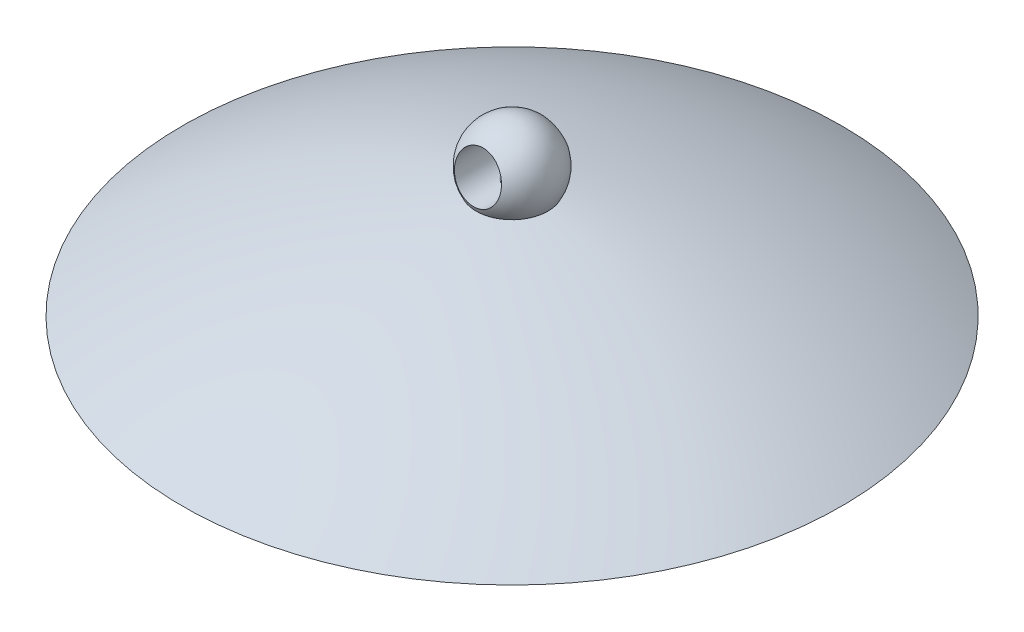
ISO-10303-21;
HEADER;
FILE_DESCRIPTION(('STEP AP214'),'2;1');
FILE_NAME('part.step','',(''),(''),'','','');
FILE_SCHEMA(('AUTOMOTIVE_DESIGN { 1 0 10303 214 1 1 1 1 }'));
ENDSEC;
DATA;
#1=APPLICATION_CONTEXT('core data for automotive mechanical design processes');
#2=APPLICATION_PROTOCOL_DEFINITION('international standard','automotive_design',2000,#1);
#3=PRODUCT_CONTEXT('',#1,'mechanical');
#4=PRODUCT('Part','Part','',(#3));
#5=PRODUCT_RELATED_PRODUCT_CATEGORY('part','',(#4));
#6=PRODUCT_DEFINITION_FORMATION('','',#4);
#7=PRODUCT_DEFINITION_CONTEXT('part definition',#1,'design');
#8=PRODUCT_DEFINITION('design','',#6,#7);
#9=PRODUCT_DEFINITION_SHAPE('','',#8);
#10=(LENGTH_UNIT() NAMED_UNIT(*) SI_UNIT(.MILLI.,.METRE.));
#11=(NAMED_UNIT(*) PLANE_ANGLE_UNIT() SI_UNIT($,.RADIAN.));
#12=(NAMED_UNIT(*) SI_UNIT($,.STERADIAN.) SOLID_ANGLE_UNIT());
#13=UNCERTAINTY_MEASURE_WITH_UNIT(LENGTH_MEASURE(1.E-05),#10,'distance_accuracy_value','');
#14=(GEOMETRIC_REPRESENTATION_CONTEXT(3) GLOBAL_UNCERTAINTY_ASSIGNED_CONTEXT((#13)) GLOBAL_UNIT_ASSIGNED_CONTEXT((#10,
#11,#12)) REPRESENTATION_CONTEXT('',''));
#15=CARTESIAN_POINT('',(0.,0.,0.));
#16=DIRECTION('',(0.,0.,1.));
#17=DIRECTION('',(1.,0.,0.));
#18=AXIS2_PLACEMENT_3D('',#15,#16,#17);
#19=CARTESIAN_POINT('',(0.,21.1056881977187,0.));
#20=DIRECTION('',(0.,-1.,0.));
#21=DIRECTION('',(1.,0.,0.));
#22=AXIS2_PLACEMENT_3D('',#19,#20,#21);
#23=SPHERICAL_SURFACE('',#22,6.78250646828144);
#24=CARTESIAN_POINT('',(-2.74655621210396,19.7015041310095,-6.04045445913077));
#25=CARTESIAN_POINT('',(-2.60538666238214,19.5490548114015,-6.06919928360541));
#26=CARTESIAN_POINT('',(-2.45118052789062,19.408045801728,-6.09558169167268));
#27=CARTESIAN_POINT('',(-2.12082004140231,19.1532265805558,-6.14301004008821));
#28=CARTESIAN_POINT('',(-1.94464399210491,19.039443586056,-6.16405064167016));
#29=CARTESIAN_POINT('',(-1.57525685654205,18.8426602519354,-6.20030429922017));
#30=CARTESIAN_POINT('',(-1.38204359063344,18.7596638580671,-6.21551660821563));
#31=CARTESIAN_POINT('',(-0.984146040427059,18.6271069585446,-6.23975952797583));
#32=CARTESIAN_POINT('',(-0.779464468628433,18.5775385823059,-6.24879159387836));
#33=CARTESIAN_POINT('',(-0.36638859466949,18.5136659172797,-6.26042261228786));
#34=CARTESIAN_POINT('',(-0.158044467273947,18.4990474263572,-6.26307888453168));
#35=CARTESIAN_POINT('',(0.25816378535431,18.5046147041414,-6.26206639311058));
#36=CARTESIAN_POINT('',(0.466027913872259,18.5248002339293,-6.25839767286477));
#37=CARTESIAN_POINT('',(0.874340758139472,18.5991617950192,-6.24485005797768));
#38=CARTESIAN_POINT('',(1.07482010841468,18.6531752794225,-6.2350008607422));
#39=CARTESIAN_POINT('',(1.46377891573875,18.7933777127773,-6.20933716707047));
#40=CARTESIAN_POINT('',(1.65225828120654,18.8795669072519,-6.19352262511449));
#41=CARTESIAN_POINT('',(2.01288883763155,19.0819895548244,-6.15618603813344));
#42=CARTESIAN_POINT('',(2.18495793012608,19.1983642364492,-6.13463715125512));
#43=CARTESIAN_POINT('',(2.50710253178697,19.4574751079959,-6.08634075229555));
#44=CARTESIAN_POINT('',(2.65717687289484,19.6002126970434,-6.05959296429557));
#45=CARTESIAN_POINT('',(2.93317720155947,19.909871574178,-6.00110955108384));
#46=CARTESIAN_POINT('',(3.0587689670924,20.077079419733,-5.96931438169568));
#47=CARTESIAN_POINT('',(3.28015884091955,20.4294360262052,-5.90170155616865));
#48=CARTESIAN_POINT('',(3.37595441983273,20.6145863084966,-5.86588355888535));
#49=CARTESIAN_POINT('',(3.53676591435141,21.0008975986491,-5.79039364970126));
#50=CARTESIAN_POINT('',(3.6012299532845,21.2022775478495,-5.75066650007975));
#51=CARTESIAN_POINT('',(3.69538222563402,21.6125420742393,-5.66882924121501));
#52=CARTESIAN_POINT('',(3.72506733519843,21.8214273238201,-5.62671891827062));
#53=CARTESIAN_POINT('',(3.7492142987302,22.2442218444931,-5.54048187131021));
#54=CARTESIAN_POINT('',(3.74311987232296,22.458158673598,-5.49633394770215));
#55=CARTESIAN_POINT('',(3.69466040264361,22.8818469589024,-5.40782487704735));
#56=CARTESIAN_POINT('',(3.65229300585108,23.0915981426185,-5.36346371635073));
#57=CARTESIAN_POINT('',(3.53196362457388,23.502614231679,-5.27546405424385));
#58=CARTESIAN_POINT('',(3.45373289888084,23.7038023023709,-5.23183363412041));
#59=CARTESIAN_POINT('',(3.2636422641545,24.090190200972,-5.1470316365888));
#60=CARTESIAN_POINT('',(3.1517823996465,24.2753900500492,-5.10586005592518));
#61=CARTESIAN_POINT('',(2.89811898434027,24.6233030135411,-5.02765200118513));
#62=CARTESIAN_POINT('',(2.75649337979403,24.7861406527795,-4.9905928688206));
#63=CARTESIAN_POINT('',(2.44670673964842,25.0856030175895,-4.92177605813534));
#64=CARTESIAN_POINT('',(2.27854841381658,25.2222304168398,-4.89001783911704));
#65=CARTESIAN_POINT('',(1.92397808442709,25.4624492964108,-4.83374153904305));
#66=CARTESIAN_POINT('',(1.73799590865465,25.5666440715629,-4.80909195887586));
#67=CARTESIAN_POINT('',(1.35034419285335,25.7421908584165,-4.7673363734533));
#68=CARTESIAN_POINT('',(1.14867727251651,25.8135483409449,-4.75022911163686));
#69=CARTESIAN_POINT('',(0.740947967132328,25.9195918445246,-4.72473454533155));
#70=CARTESIAN_POINT('',(0.535131202726846,25.9551719791778,-4.7161347250612));
#71=CARTESIAN_POINT('',(0.120277768677626,25.9916276231622,-4.70732271020955));
#72=CARTESIAN_POINT('',(-0.0887585308840101,25.9925070919495,-4.70710955868279));
#73=CARTESIAN_POINT('',(-0.500552584656983,25.9598073269342,-4.71501471171187));
#74=CARTESIAN_POINT('',(-0.703357245499722,25.9267821638162,-4.72299905269232));
#75=CARTESIAN_POINT('',(-1.10041787757755,25.8282090330291,-4.74670990782127));
#76=CARTESIAN_POINT('',(-1.2946738278166,25.7626609854871,-4.76243644098381));
#77=CARTESIAN_POINT('',(-1.67011568328311,25.6007878160622,-4.80099236656408));
#78=CARTESIAN_POINT('',(-1.85124276178314,25.5043335472437,-4.82385155329881));
#79=CARTESIAN_POINT('',(-2.19474861689308,25.2836875657185,-4.87566880412402));
#80=CARTESIAN_POINT('',(-2.35712555555285,25.1594931373257,-4.90462746532059));
#81=CARTESIAN_POINT('',(-2.66224685482032,24.8840754567925,-4.96817662982521));
#82=CARTESIAN_POINT('',(-2.80450213252836,24.7323350988979,-5.00287349532585));
#83=CARTESIAN_POINT('',(-3.06163718924429,24.4080343119174,-5.07616620314953));
#84=CARTESIAN_POINT('',(-3.17651340813587,24.2354711796226,-5.11476255159671));
#85=CARTESIAN_POINT('',(-3.37857434163891,23.8697592132671,-5.19556782239263));
#86=CARTESIAN_POINT('',(-3.46500021029758,23.6762054676108,-5.23784267159348));
#87=CARTESIAN_POINT('',(-3.6039741371735,23.2775977236051,-5.32381277494318));
#88=CARTESIAN_POINT('',(-3.65652014263159,23.0725430292388,-5.3675081149902));
#89=CARTESIAN_POINT('',(-3.72693085126207,22.6532494622101,-5.45575933670477));
#90=CARTESIAN_POINT('',(-3.74423394000088,22.4389166298192,-5.50031789919655));
#91=CARTESIAN_POINT('',(-3.74193424038199,22.0101673506976,-5.58839378024791));
#92=CARTESIAN_POINT('',(-3.72232146825242,21.7957508970315,-5.63191081390604));
#93=CARTESIAN_POINT('',(-3.64649308544849,21.372570669963,-5.71685142198572));
#94=CARTESIAN_POINT('',(-3.59019816726528,21.1638201674414,-5.75827025045182));
#95=CARTESIAN_POINT('',(-3.44232258354258,20.7587422415996,-5.83784179383274));
#96=CARTESIAN_POINT('',(-3.35078512793489,20.5623999467525,-5.87599843868544));
#97=CARTESIAN_POINT('',(-3.17324186972645,20.2543760020344,-5.93533930298478));
#98=CARTESIAN_POINT('',(-3.09675942704412,20.1373389064322,-5.95774835057583));
#99=CARTESIAN_POINT('',(-2.93101252093392,19.9123020360136,-6.00061446327821));
#100=CARTESIAN_POINT('',(-2.8417481910571,19.8043021667909,-6.02107154878082));
#101=CARTESIAN_POINT('',(-2.74655621210396,19.7015041310095,-6.04045445913077));
#102=B_SPLINE_CURVE_WITH_KNOTS('',3,(#24,#25,#26,#27,#28,#29,#30,#31,#32,#33,#34,#35,#36,#37,
#38,#39,#40,#41,#42,#43,#44,#45,#46,#47,#48,#49,#50,#51,#52,#53,#54,#55,#56,#57,#58,#59,#60,#61,
#62,#63,#64,#65,#66,#67,#68,#69,#70,#71,#72,#73,#74,#75,#76,#77,#78,#79,#80,#81,#82,#83,#84,#85,
#86,#87,#88,#89,#90,#91,#92,#93,#94,#95,#96,#97,#98,#99,#100,#101),.UNSPECIFIED.,.T.,.F.,(4,2,2,
2,2,2,2,2,2,2,2,2,2,2,2,2,2,2,2,2,2,2,2,2,2,2,2,2,2,2,2,2,2,2,2,2,2,2,4),(0.,0.628750069239147,
1.25812607868099,1.88758272400236,2.51689111275756,3.14052033897988,3.76414528419697,
4.38479639720716,5.00545224631366,5.62906604258188,6.25271294464118,6.88435444426467,
7.51604954894505,8.15850086784761,8.80100988746337,9.45353446579078,10.1061013854619,
10.7636403140058,11.421178371966,12.07489197778,12.7285388634618,13.3691785109865,
14.0097113866547,14.6338060890066,15.2578295799702,15.8718151094308,16.4858021467847,
17.102389046335,17.7190363345393,18.3487540698385,18.9785536431134,19.623999463368,
20.2694843870967,20.925177426393,21.581047821172,22.2383409464982,22.8948307355967,
23.3188073565996,23.7427795480229),.UNSPECIFIED.);
#103=CARTESIAN_POINT('',(-2.74655621210396,19.7015041310095,-6.04045445913077));
#104=VERTEX_POINT('',#103);
#105=EDGE_CURVE('E56',#104,#104,#102,.T.);
#106=ORIENTED_EDGE('',*,*,#105,.T.);
#107=EDGE_LOOP('',(#106));
#108=FACE_BOUND('',#107,.T.);
#109=CARTESIAN_POINT('',(-2.74655621210396,19.7015041310095,6.04045445913077));
#110=CARTESIAN_POINT('',(-2.89125895416341,19.8577967473244,6.01098485009689));
#111=CARTESIAN_POINT('',(-3.02247075184095,20.026342568026,5.97898890797436));
#112=CARTESIAN_POINT('',(-3.25421593544648,20.3827871960837,5.91069937804084));
#113=CARTESIAN_POINT('',(-3.35470569982538,20.570713019372,5.87439978005081));
#114=CARTESIAN_POINT('',(-3.52217858302214,20.9600439254629,5.79842317811655));
#115=CARTESIAN_POINT('',(-3.58920129468056,21.161432759492,5.75875023034611));
#116=CARTESIAN_POINT('',(-3.68827419647267,21.5720798407019,5.67695264377764));
#117=CARTESIAN_POINT('',(-3.72033323447657,21.7813360830922,5.6348286280878));
#118=CARTESIAN_POINT('',(-3.74899470711751,22.2044694980106,5.54864683711982));
#119=CARTESIAN_POINT('',(-3.7451721429754,22.4183720411162,5.50457205326978));
#120=CARTESIAN_POINT('',(-3.70124633633718,22.8423761380936,5.41613120135221));
#121=CARTESIAN_POINT('',(-3.66113904148144,23.0524772647414,5.37176510129927));
#122=CARTESIAN_POINT('',(-3.54525833825089,23.4646396204926,5.28365673700847));
#123=CARTESIAN_POINT('',(-3.46920319174019,23.6666234170655,5.23992226393747));
#124=CARTESIAN_POINT('',(-3.28331410289142,24.0549569464945,5.15482344755856));
#125=CARTESIAN_POINT('',(-3.17348018125119,24.2413066889303,5.11345910279837));
#126=CARTESIAN_POINT('',(-2.92359206149183,24.5919279183005,5.03475656440865));
#127=CARTESIAN_POINT('',(-2.78370262214488,24.7563121495288,4.99739802206161));
#128=CARTESIAN_POINT('',(-2.47710314437376,25.0591419567636,4.92789798707674));
#129=CARTESIAN_POINT('',(-2.3103958209288,25.1975901554049,4.89575596699154));
#130=CARTESIAN_POINT('',(-1.9583000887206,25.4416851434496,4.83863405872513));
#131=CARTESIAN_POINT('',(-1.77334018396147,25.5479198207917,4.81352653575185));
#132=CARTESIAN_POINT('',(-1.38735604210823,25.7276827582229,4.77080333304568));
#133=CARTESIAN_POINT('',(-1.18633445872497,25.8012164080491,4.75318641874233));
#134=CARTESIAN_POINT('',(-0.779490410465534,25.9116172264782,4.72665791410944));
#135=CARTESIAN_POINT('',(-0.57392411953818,25.9493781957167,4.71753422318953));
#136=CARTESIAN_POINT('',(-0.159184400752955,25.9901844567097,4.70767240683312));
#137=CARTESIAN_POINT('',(0.0499885980465354,25.9932338496474,4.70693329075665));
#138=CARTESIAN_POINT('',(0.462316979146898,25.9647618324614,4.71381737750187));
#139=CARTESIAN_POINT('',(0.665514607579746,25.9338137020607,4.72130191031478));
#140=CARTESIAN_POINT('',(1.06370536956796,25.839281352582,4.74405125382851));
#141=CARTESIAN_POINT('',(1.25869850335445,25.7756971344234,4.75931606431015));
#142=CARTESIAN_POINT('',(1.63580300070164,25.6176420849377,4.79699055784002));
#143=CARTESIAN_POINT('',(1.81786582576094,25.5230616593223,4.81942558577588));
#144=CARTESIAN_POINT('',(2.16353763172943,25.3059826440025,4.87045585562421));
#145=CARTESIAN_POINT('',(2.32714487336034,25.1834814262866,4.8990516774002));
#146=CARTESIAN_POINT('',(2.63495747312673,24.9113101217757,4.9619269727519));
#147=CARTESIAN_POINT('',(2.77868727336432,24.7611268981184,4.99631250292903));
#148=CARTESIAN_POINT('',(3.03901342588446,24.4396900540364,5.06905660481827));
#149=CARTESIAN_POINT('',(3.15560629966037,24.2684337366847,5.10741568496431));
#150=CARTESIAN_POINT('',(3.36135545567981,23.9050667673338,5.18782051923384));
#151=CARTESIAN_POINT('',(3.44975529843775,23.7125426599992,5.22993434083444));
#152=CARTESIAN_POINT('',(3.59283955298661,23.315660134419,5.31566271173877));
#153=CARTESIAN_POINT('',(3.64752060494805,23.1113005390726,5.35927741013682));
#154=CARTESIAN_POINT('',(3.72236182932417,22.6929484585816,5.44746527307104));
#155=CARTESIAN_POINT('',(3.74194409796527,22.4788531976354,5.49204246385458));
#156=CARTESIAN_POINT('',(3.74422592026043,22.0502562694007,5.58021782332625));
#157=CARTESIAN_POINT('',(3.72692428795243,21.8357545892659,5.62381596048842));
#158=CARTESIAN_POINT('',(3.65568904524366,21.4120031258771,5.70899085471226));
#159=CARTESIAN_POINT('',(3.60167693858106,21.2027655949157,5.75056307530094));
#160=CARTESIAN_POINT('',(3.45824255294012,20.7961485402456,5.83054104192369));
#161=CARTESIAN_POINT('',(3.36882177332569,20.5987685148439,5.8689469219518));
#162=CARTESIAN_POINT('',(3.15798950714147,20.2237483993422,5.94127682124314));
#163=CARTESIAN_POINT('',(3.03691734739983,20.0459257723666,5.97524296582941));
#164=CARTESIAN_POINT('',(2.76561418123407,19.7131254724733,6.0383453901035));
#165=CARTESIAN_POINT('',(2.61538570090182,19.5581458224944,6.06748208780748));
#166=CARTESIAN_POINT('',(2.29273437412668,19.2782740636437,6.11979057580419));
#167=CARTESIAN_POINT('',(2.12072780763614,19.1529192997484,6.14305453852764));
#168=CARTESIAN_POINT('',(1.75745897832549,18.9329130777002,6.1837102349228));
#169=CARTESIAN_POINT('',(1.56619853482559,18.8382587221934,6.20110252274072));
#170=CARTESIAN_POINT('',(1.17324714176204,18.6839604608659,6.22937735811024));
#171=CARTESIAN_POINT('',(0.971779614675157,18.6237660845548,6.24036231470466));
#172=CARTESIAN_POINT('',(0.561390622193364,18.5379028309225,6.25601393454361));
#173=CARTESIAN_POINT('',(0.352469982805066,18.5122301397912,6.2606812957298));
#174=CARTESIAN_POINT('',(-0.0645255736160385,18.4963018034906,6.26357829956653));
#175=CARTESIAN_POINT('',(-0.272585851957733,18.5056723692335,6.26187588536179));
#176=CARTESIAN_POINT('',(-0.684192708099118,18.5587121989961,6.25222120137608));
#177=CARTESIAN_POINT('',(-0.887738230836768,18.6023893951482,6.24426748621396));
#178=CARTESIAN_POINT('',(-1.28427792024794,18.7226155327595,6.22229963105485));
#179=CARTESIAN_POINT('',(-1.47728246321858,18.7991314662366,6.20829157650065));
#180=CARTESIAN_POINT('',(-1.84745393565846,18.9826445906618,6.17453301477678));
#181=CARTESIAN_POINT('',(-2.0246395810477,19.0896051164354,6.15478941448042));
#182=CARTESIAN_POINT('',(-2.29204186893383,19.2827012736235,6.11892626072104));
#183=CARTESIAN_POINT('',(-2.38883471787336,19.3602173085763,6.10448520819932));
#184=CARTESIAN_POINT('',(-2.57411729853324,19.524282289724,6.07379767873547));
#185=CARTESIAN_POINT('',(-2.66260709629197,19.6108311640647,6.05755121615493));
#186=CARTESIAN_POINT('',(-2.74655621210396,19.7015041310095,6.04045445913077));
#187=B_SPLINE_CURVE_WITH_KNOTS('',3,(#109,#110,#111,#112,#113,#114,#115,#116,#117,#118,#119,
#120,#121,#122,#123,#124,#125,#126,#127,#128,#129,#130,#131,#132,#133,#134,#135,#136,#137,#138,
#139,#140,#141,#142,#143,#144,#145,#146,#147,#148,#149,#150,#151,#152,#153,#154,#155,#156,#157,
#158,#159,#160,#161,#162,#163,#164,#165,#166,#167,#168,#169,#170,#171,#172,#173,#174,#175,#176,
#177,#178,#179,#180,#181,#182,#183,#184,#185,#186),.UNSPECIFIED.,.T.,.F.,(4,2,2,2,2,2,2,2,2,2,2,
2,2,2,2,2,2,2,2,2,2,2,2,2,2,2,2,2,2,2,2,2,2,2,2,2,2,2,4),(0.,0.644603192870816,1.29011743800286,
1.93486619429186,2.57945175325782,3.23168163512963,3.88398436848226,4.5414864548816,
5.19898813839942,5.85297351627211,6.50689272782854,7.14803890503217,7.78907937023205,
8.41364430977206,9.03813545601341,9.65225561626213,10.266375759211,10.8826911252281,
11.4990645251709,12.1282870747118,12.757590235846,13.4025815882048,14.0476371988269,
14.7032193909815,15.3588226629929,16.0158322089377,16.6728139370912,17.3230222310197,
17.9731742162914,18.6123794505449,19.2515243421787,19.8801520481307,20.5087103002393,
21.1305832500893,21.7526000272742,22.3739930408698,22.9946408391435,23.3686095542894,
23.7425752948202),.UNSPECIFIED.);
#188=CARTESIAN_POINT('',(-2.74655621210396,19.7015041310095,6.04045445913077));
#189=VERTEX_POINT('',#188);
#190=EDGE_CURVE('E65',#189,#189,#187,.T.);
#191=ORIENTED_EDGE('',*,*,#190,.T.);
#192=EDGE_LOOP('',(#191));
#193=FACE_BOUND('',#192,.T.);
#194=CARTESIAN_POINT('',(0.,17.6470249601918,0.));
#195=DIRECTION('',(0.,-1.,0.));
#196=DIRECTION('',(0.,0.,-1.));
#197=AXIS2_PLACEMENT_3D('',#194,#195,#196);
#198=CIRCLE('',#197,5.83438450924002);
#199=CARTESIAN_POINT('',(0.,17.6470249601918,-5.83438450924002));
#200=VERTEX_POINT('',#199);
#201=EDGE_CURVE('E10',#200,#200,#198,.T.);
#202=ORIENTED_EDGE('',*,*,#201,.F.);
#203=EDGE_LOOP('',(#202));
#204=FACE_BOUND('',#203,.T.);
#205=ADVANCED_FACE('F37',(#108,#193,#204),#23,.T.);
#206=CARTESIAN_POINT('',(0.,-113.724241087981,0.));
#207=DIRECTION('',(0.,-1.,0.));
#208=DIRECTION('',(0.,0.,-1.));
#209=AXIS2_PLACEMENT_3D('',#206,#207,#208);
#210=DEGENERATE_TOROIDAL_SURFACE('',#209,15.7031075677018,133.125028105402,.F.);
#211=CARTESIAN_POINT('',(0.,0.,0.));
#212=DIRECTION('',(0.,-1.,0.));
#213=DIRECTION('',(0.,0.,-1.));
#214=AXIS2_PLACEMENT_3D('',#211,#212,#213);
#215=CIRCLE('',#214,53.5);
#216=CARTESIAN_POINT('',(0.,0.,-53.5));
#217=VERTEX_POINT('',#216);
#218=EDGE_CURVE('E51',#217,#217,#215,.T.);
#219=ORIENTED_EDGE('',*,*,#218,.F.);
#220=EDGE_LOOP('',(#219));
#221=FACE_BOUND('',#220,.T.);
#222=ORIENTED_EDGE('',*,*,#201,.T.);
#223=EDGE_LOOP('',(#222));
#224=FACE_BOUND('',#223,.T.);
#225=ADVANCED_FACE('F80',(#221,#224),#210,.F.);
#226=CARTESIAN_POINT('',(0.,0.,0.));
#227=DIRECTION('',(0.,1.,0.));
#228=DIRECTION('',(0.,0.,1.));
#229=AXIS2_PLACEMENT_3D('',#226,#227,#228);
#230=PLANE('',#229);
#231=ORIENTED_EDGE('',*,*,#218,.T.);
#232=EDGE_LOOP('',(#231));
#233=FACE_BOUND('',#232,.T.);
#234=ADVANCED_FACE('F75',(#233),#230,.F.);
#235=CARTESIAN_POINT('',(0.,22.2446343246565,-53.5));
#236=DIRECTION('',(0.,0.,1.));
#237=DIRECTION('',(1.,0.,0.));
#238=AXIS2_PLACEMENT_3D('',#235,#236,#237);
#239=CYLINDRICAL_SURFACE('',#238,3.7431380161685);
#240=ORIENTED_EDGE('',*,*,#190,.F.);
#241=EDGE_LOOP('',(#240));
#242=FACE_BOUND('',#241,.T.);
#243=CARTESIAN_POINT('',(-1.72596518620831,18.9231698307799,0.));
#244=CARTESIAN_POINT('',(-1.72595942536063,18.9231661311022,0.032095441646626));
#245=CARTESIAN_POINT('',(-1.72332693588441,18.9217947514217,0.0642254020712158));
#246=CARTESIAN_POINT('',(-1.71303343522657,18.9164772644491,0.127489200239605));
#247=CARTESIAN_POINT('',(-1.70535989033871,18.9125247397353,0.158620351740871));
#248=CARTESIAN_POINT('',(-1.68571505602514,18.9025443633745,0.218820985539084));
#249=CARTESIAN_POINT('',(-1.67377974121045,18.8965339002282,0.247905356321693));
#250=CARTESIAN_POINT('',(-1.64635960976484,18.8829654888194,0.303918781413457));
#251=CARTESIAN_POINT('',(-1.63087474055098,18.8754075176325,0.330847803785397));
#252=CARTESIAN_POINT('',(-1.58516466534213,18.8535666530843,0.400606579675203));
#253=CARTESIAN_POINT('',(-1.55221919711793,18.8382854909242,0.441339035753827));
#254=CARTESIAN_POINT('',(-1.48055785332376,18.806526107414,0.516845932222753));
#255=CARTESIAN_POINT('',(-1.44182295470631,18.7900440351971,0.55159988661726));
#256=CARTESIAN_POINT('',(-1.33459289624303,18.7467739287795,0.636062762328434));
#257=CARTESIAN_POINT('',(-1.26269037241739,18.7200171279634,0.681448410020446));
#258=CARTESIAN_POINT('',(-1.11203587532271,18.6696033366386,0.7610196590032));
#259=CARTESIAN_POINT('',(-1.03327160393777,18.6459521105335,0.795184604593054));
#260=CARTESIAN_POINT('',(-0.836882827385975,18.5943125380667,0.866537333782005));
#261=CARTESIAN_POINT('',(-0.716875106139969,18.5686996879398,0.898926675709704));
#262=CARTESIAN_POINT('',(-0.471853743664194,18.5292732278682,0.947528737950689));
#263=CARTESIAN_POINT('',(-0.346837787556615,18.5154651416925,0.963733885837028));
#264=CARTESIAN_POINT('',(-0.0931658146737409,18.5004689868249,0.981297910666601));
#265=CARTESIAN_POINT('',(0.0355166957826964,18.4994695960323,0.98243483409213));
#266=CARTESIAN_POINT('',(0.291578195303216,18.5106722486644,0.969368706731006));
#267=CARTESIAN_POINT('',(0.418956977307475,18.5228763572243,0.955163256272184));
#268=CARTESIAN_POINT('',(0.65426055882274,18.5574284675951,0.912963794371536));
#269=CARTESIAN_POINT('',(0.762713536595261,18.5784172604176,0.88678449459559));
#270=CARTESIAN_POINT('',(0.973041689330185,18.6285795576074,0.81988127435497));
#271=CARTESIAN_POINT('',(1.07492989547182,18.6577361917971,0.779187286251249));
#272=CARTESIAN_POINT('',(1.22625122332029,18.7075770647531,0.701334838440934));
#273=CARTESIAN_POINT('',(1.2793829732736,18.72650491308,0.670196445557484));
#274=CARTESIAN_POINT('',(1.3808095460618,18.7650709271993,0.601112917437929));
#275=CARTESIAN_POINT('',(1.42910925937682,18.7847083468598,0.563174775046082));
#276=CARTESIAN_POINT('',(1.50657808731036,18.8178895589951,0.49065994018773));
#277=CARTESIAN_POINT('',(1.53738901312897,18.8316455061017,0.457947253173636));
#278=CARTESIAN_POINT('',(1.59391419552429,18.8576768878859,0.387828633294747));
#279=CARTESIAN_POINT('',(1.61963782318953,18.8699550281177,0.350431540988472));
#280=CARTESIAN_POINT('',(1.65792876015481,18.8886428269905,0.281910015454698));
#281=CARTESIAN_POINT('',(1.67216683075365,18.8957361445213,0.25191472331236));
#282=CARTESIAN_POINT('',(1.69608773882651,18.9077872220788,0.189743311829322));
#283=CARTESIAN_POINT('',(1.7057753357024,18.9127472129205,0.157569511512264));
#284=CARTESIAN_POINT('',(1.71983247190046,18.9199802897833,0.0914567671034414));
#285=CARTESIAN_POINT('',(1.72415496309579,18.9222296001644,0.0575048910036836));
#286=CARTESIAN_POINT('',(1.7268497449233,18.9236291312857,-0.0106966063186639));
#287=CARTESIAN_POINT('',(1.72522440134665,18.9227805842199,-0.044946103753637));
#288=CARTESIAN_POINT('',(1.71677720243589,18.9184090138791,-0.108281036507185));
#289=CARTESIAN_POINT('',(1.71061893670069,18.9152277006602,-0.137483590539011));
#290=CARTESIAN_POINT('',(1.69436093107298,18.9069245605662,-0.194469094221545));
#291=CARTESIAN_POINT('',(1.68425925727809,18.9018017816052,-0.22225133976098));
#292=CARTESIAN_POINT('',(1.6555201938831,18.8874494906496,-0.287870119843013));
#293=CARTESIAN_POINT('',(1.63508315306264,18.8774052099714,-0.324736865985905));
#294=CARTESIAN_POINT('',(1.58899775110438,18.8554123605498,-0.394416949242361));
#295=CARTESIAN_POINT('',(1.56333651356138,18.843459102632,-0.427219942457744));
#296=CARTESIAN_POINT('',(1.4923409834151,18.8115249686274,-0.506641522154406));
#297=CARTESIAN_POINT('',(1.44415378565719,18.7908656210587,-0.550419891409842));
#298=CARTESIAN_POINT('',(1.34149324582639,18.7496981393926,-0.629855100825807));
#299=CARTESIAN_POINT('',(1.28700519756577,18.7291904829529,-0.665492338853141));
#300=CARTESIAN_POINT('',(1.14022648721899,18.6781239668866,-0.748894406997826));
#301=CARTESIAN_POINT('',(1.04456157846543,18.6487533053609,-0.791452162103217));
#302=CARTESIAN_POINT('',(0.846529720680645,18.5970284291692,-0.862637444252901));
#303=CARTESIAN_POINT('',(0.744156491874393,18.5746809057391,-0.891251700946351));
#304=CARTESIAN_POINT('',(0.530994672547646,18.5377092384305,-0.937331555815542));
#305=CARTESIAN_POINT('',(0.420033164649772,18.5234449329234,-0.954284031753571));
#306=CARTESIAN_POINT('',(0.196131232810687,18.504947744075,-0.97610199150385));
#307=CARTESIAN_POINT('',(0.0831905078292775,18.5007164003312,-0.98096562024053));
#308=CARTESIAN_POINT('',(-0.164357753023675,18.5026849757745,-0.978689819733798));
#309=CARTESIAN_POINT('',(-0.298935908946306,18.5110580206819,-0.969050013378559));
#310=CARTESIAN_POINT('',(-0.564133992937225,18.5418513595319,-0.932185738048537));
#311=CARTESIAN_POINT('',(-0.694754007678462,18.5642713456499,-0.904961654415201));
#312=CARTESIAN_POINT('',(-0.90848776926481,18.6123042686042,-0.841879245201083));
#313=CARTESIAN_POINT('',(-0.993865267426734,18.6348187942545,-0.811245118392032));
#314=CARTESIAN_POINT('',(-1.15833485568766,18.6842083115413,-0.738697536041904));
#315=CARTESIAN_POINT('',(-1.23744063478453,18.7110733939858,-0.696809573552261));
#316=CARTESIAN_POINT('',(-1.3562946045316,18.7555301763081,-0.618635803138398));
#317=CARTESIAN_POINT('',(-1.39916528814076,18.772551426736,-0.586768653900839));
#318=CARTESIAN_POINT('',(-1.4800863972048,18.8062730537512,-0.517197606028078));
#319=CARTESIAN_POINT('',(-1.51814273723474,18.8229738022496,-0.479500998193971));
#320=CARTESIAN_POINT('',(-1.5778883175795,18.8502092401933,-0.408751928950132));
#321=CARTESIAN_POINT('',(-1.60120582000728,18.8611801333683,-0.377254243606357));
#322=CARTESIAN_POINT('',(-1.6430284725901,18.8812912981593,-0.310642035157499));
#323=CARTESIAN_POINT('',(-1.66153996804617,18.8904339798315,-0.275532367349558));
#324=CARTESIAN_POINT('',(-1.68895409092009,18.904170298087,-0.21001731098694));
#325=CARTESIAN_POINT('',(-1.69906955004538,18.9093203341943,-0.180240350792781));
#326=CARTESIAN_POINT('',(-1.7147065473392,18.9173315939264,-0.119247736512834));
#327=CARTESIAN_POINT('',(-1.72024120066495,18.9201993509582,-0.0880364616898373));
#328=CARTESIAN_POINT('',(-1.72506205332475,18.9227004134311,-0.037768390207811));
#329=CARTESIAN_POINT('',(-1.72596857682731,18.9231720082716,-0.0188901738569421));
#330=CARTESIAN_POINT('',(-1.72596518620831,18.9231698307799,0.));
#331=B_SPLINE_CURVE_WITH_KNOTS('',3,(#243,#244,#245,#246,#247,#248,#249,#250,#251,#252,#253,
#254,#255,#256,#257,#258,#259,#260,#261,#262,#263,#264,#265,#266,#267,#268,#269,#270,#271,#272,
#273,#274,#275,#276,#277,#278,#279,#280,#281,#282,#283,#284,#285,#286,#287,#288,#289,#290,#291,
#292,#293,#294,#295,#296,#297,#298,#299,#300,#301,#302,#303,#304,#305,#306,#307,#308,#309,#310,
#311,#312,#313,#314,#315,#316,#317,#318,#319,#320,#321,#322,#323,#324,#325,#326,#327,#328,#329,
#330),.UNSPECIFIED.,.T.,.F.,(4,2,2,2,2,2,2,2,2,2,2,2,2,2,2,2,2,2,2,2,2,2,2,2,2,2,2,2,2,2,2,2,2,
2,2,2,2,2,2,2,2,2,2,4),(0.,0.0962175503146138,0.192675238848508,0.288337240011377,
0.384000658398769,0.546771212079597,0.710088863140321,0.97601886568473,1.24243569850885,
1.62117561030674,2.00009264791975,2.38458499771288,2.76913749394964,3.10854028679297,
3.44724716793565,3.64013767453532,3.8328309395073,3.973430614983,4.11376883496998,
4.21526032969346,4.31664543542103,4.41891347431348,4.52114083982977,4.61079736614858,
4.70049791662866,4.82976020225092,4.95934503224199,5.1631076710415,5.36735587438981,
5.69181673557547,6.01658579349356,6.35486090776742,6.69318792832803,7.09687595994479,
7.50055514545146,7.7801831373986,8.05918295886858,8.2270092391194,8.39462729469856,
8.5163477250636,8.63790662293614,8.73313371695136,8.82808721687825,8.88471726028266),.UNSPECIFIED.);
#332=CARTESIAN_POINT('',(-1.72596518620831,18.9231698307799,0.));
#333=VERTEX_POINT('',#332);
#334=EDGE_CURVE('E42',#333,#333,#331,.T.);
#335=ORIENTED_EDGE('',*,*,#334,.F.);
#336=EDGE_LOOP('',(#335));
#337=FACE_BOUND('',#336,.T.);
#338=ORIENTED_EDGE('',*,*,#105,.F.);
#339=EDGE_LOOP('',(#338));
#340=FACE_BOUND('',#339,.T.);
#341=ADVANCED_FACE('F71',(#242,#337,#340),#239,.F.);
#342=CARTESIAN_POINT('',(0.,21.1056881977187,0.));
#343=DIRECTION('',(0.,-1.,0.));
#344=DIRECTION('',(-1.,0.,0.));
#345=AXIS2_PLACEMENT_3D('',#342,#343,#344);
#346=SPHERICAL_SURFACE('',#345,2.78250646828144);
#347=ORIENTED_EDGE('',*,*,#334,.T.);
#348=EDGE_LOOP('',(#347));
#349=FACE_BOUND('',#348,.T.);
#350=ADVANCED_FACE('F39',(#349),#346,.F.);
#351=CLOSED_SHELL('',(#205,#225,#234,#341,#350));
#352=MANIFOLD_SOLID_BREP('B2',#351);
#353=ADVANCED_BREP_SHAPE_REPRESENTATION('',(#18,#352),#14);
#354=SHAPE_DEFINITION_REPRESENTATION(#9,#353);
ENDSEC;
END-ISO-10303-21;
